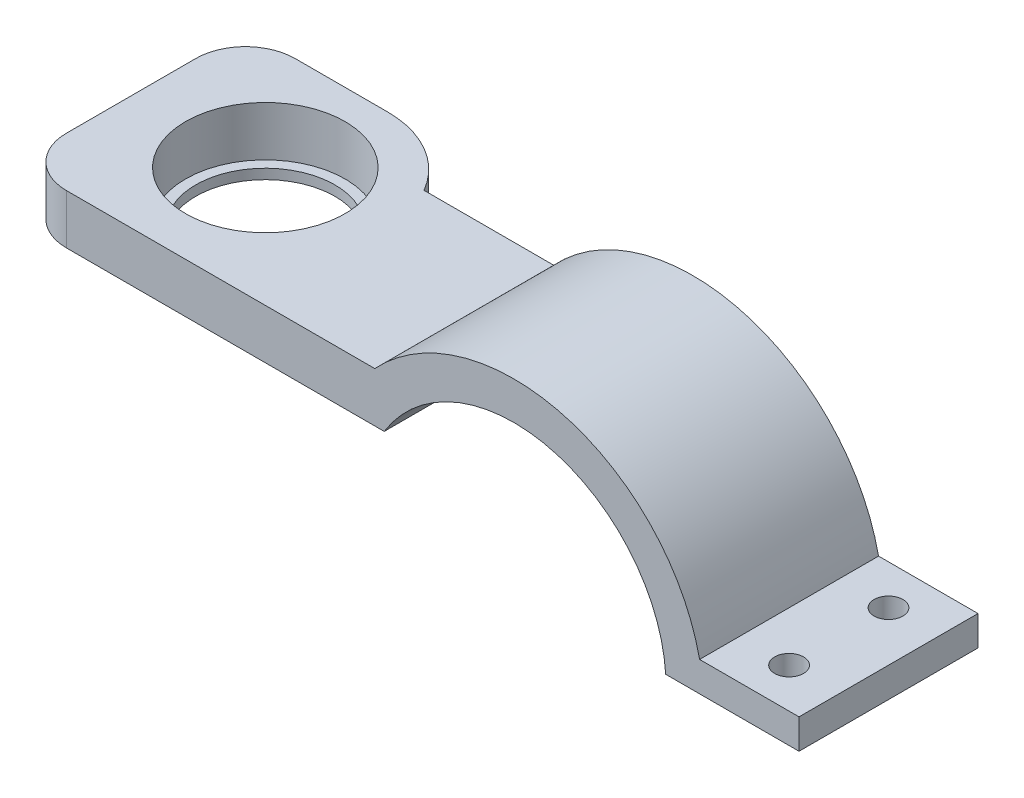
ISO-10303-21;
HEADER;
FILE_DESCRIPTION(('STEP AP214'),'2;1');
FILE_NAME('part.step','',(''),(''),'','','');
FILE_SCHEMA(('AUTOMOTIVE_DESIGN { 1 0 10303 214 1 1 1 1 }'));
ENDSEC;
DATA;
#1=APPLICATION_CONTEXT('core data for automotive mechanical design processes');
#2=APPLICATION_PROTOCOL_DEFINITION('international standard','automotive_design',2000,#1);
#3=PRODUCT_CONTEXT('',#1,'mechanical');
#4=PRODUCT('Part','Part','',(#3));
#5=PRODUCT_RELATED_PRODUCT_CATEGORY('part','',(#4));
#6=PRODUCT_DEFINITION_FORMATION('','',#4);
#7=PRODUCT_DEFINITION_CONTEXT('part definition',#1,'design');
#8=PRODUCT_DEFINITION('design','',#6,#7);
#9=PRODUCT_DEFINITION_SHAPE('','',#8);
#10=(LENGTH_UNIT() NAMED_UNIT(*) SI_UNIT(.MILLI.,.METRE.));
#11=(NAMED_UNIT(*) PLANE_ANGLE_UNIT() SI_UNIT($,.RADIAN.));
#12=(NAMED_UNIT(*) SI_UNIT($,.STERADIAN.) SOLID_ANGLE_UNIT());
#13=UNCERTAINTY_MEASURE_WITH_UNIT(LENGTH_MEASURE(1.E-05),#10,'distance_accuracy_value','');
#14=(GEOMETRIC_REPRESENTATION_CONTEXT(3) GLOBAL_UNCERTAINTY_ASSIGNED_CONTEXT((#13)) GLOBAL_UNIT_ASSIGNED_CONTEXT((#10,
#11,#12)) REPRESENTATION_CONTEXT('',''));
#15=CARTESIAN_POINT('',(0.,0.,0.));
#16=DIRECTION('',(0.,0.,1.));
#17=DIRECTION('',(1.,0.,0.));
#18=AXIS2_PLACEMENT_3D('',#15,#16,#17);
#19=CARTESIAN_POINT('',(0.,0.,0.));
#20=DIRECTION('',(0.,0.,1.));
#21=DIRECTION('',(1.,0.,0.));
#22=AXIS2_PLACEMENT_3D('',#19,#20,#21);
#23=PLANE('',#22);
#24=DIRECTION('',(0.,-1.,0.));
#25=VECTOR('',#24,1.);
#26=CARTESIAN_POINT('',(-27.0418556961807,36.496305877201,0.));
#27=LINE('',#26,#25);
#28=CARTESIAN_POINT('',(-27.0418556961807,13.,0.));
#29=VERTEX_POINT('',#28);
#30=CARTESIAN_POINT('',(-27.0418556961807,8.,0.));
#31=VERTEX_POINT('',#30);
#32=EDGE_CURVE('E145',#29,#31,#27,.T.);
#33=ORIENTED_EDGE('',*,*,#32,.F.);
#34=DIRECTION('',(-1.,0.,0.));
#35=VECTOR('',#34,1.);
#36=CARTESIAN_POINT('',(-50.,13.,0.));
#37=LINE('',#36,#35);
#38=CARTESIAN_POINT('',(-13.9932126404196,13.,0.));
#39=VERTEX_POINT('',#38);
#40=EDGE_CURVE('E150',#39,#29,#37,.T.);
#41=ORIENTED_EDGE('',*,*,#40,.F.);
#42=CARTESIAN_POINT('',(0.,0.,0.));
#43=DIRECTION('',(0.,0.,1.));
#44=DIRECTION('',(1.,0.,0.));
#45=AXIS2_PLACEMENT_3D('',#42,#43,#44);
#46=CIRCLE('',#45,19.1);
#47=CARTESIAN_POINT('',(18.6764557665527,4.,0.));
#48=VERTEX_POINT('',#47);
#49=EDGE_CURVE('E212',#48,#39,#46,.T.);
#50=ORIENTED_EDGE('',*,*,#49,.F.);
#51=DIRECTION('',(-1.,0.,0.));
#52=VECTOR('',#51,1.);
#53=CARTESIAN_POINT('',(18.6764557665527,4.,0.));
#54=LINE('',#53,#52);
#55=CARTESIAN_POINT('',(28.6764557665527,4.,0.));
#56=VERTEX_POINT('',#55);
#57=EDGE_CURVE('E209',#56,#48,#54,.T.);
#58=ORIENTED_EDGE('',*,*,#57,.F.);
#59=DIRECTION('',(0.,1.,0.));
#60=VECTOR('',#59,1.);
#61=CARTESIAN_POINT('',(28.6764557665527,4.,0.));
#62=LINE('',#61,#60);
#63=CARTESIAN_POINT('',(28.6764557665527,1.,0.));
#64=VERTEX_POINT('',#63);
#65=EDGE_CURVE('E206',#64,#56,#62,.T.);
#66=ORIENTED_EDGE('',*,*,#65,.F.);
#67=DIRECTION('',(1.,0.,0.));
#68=VECTOR('',#67,1.);
#69=CARTESIAN_POINT('',(15.2672852858653,1.,0.));
#70=LINE('',#69,#68);
#71=CARTESIAN_POINT('',(15.2672852858653,1.,0.));
#72=VERTEX_POINT('',#71);
#73=EDGE_CURVE('E203',#72,#64,#70,.T.);
#74=ORIENTED_EDGE('',*,*,#73,.F.);
#75=CARTESIAN_POINT('',(0.,0.,0.));
#76=DIRECTION('',(0.,0.,-1.));
#77=DIRECTION('',(1.,0.,0.));
#78=AXIS2_PLACEMENT_3D('',#75,#76,#77);
#79=CIRCLE('',#78,15.3);
#80=CARTESIAN_POINT('',(-13.0418556961807,8.,0.));
#81=VERTEX_POINT('',#80);
#82=EDGE_CURVE('E147',#81,#72,#79,.T.);
#83=ORIENTED_EDGE('',*,*,#82,.F.);
#84=DIRECTION('',(1.,0.,0.));
#85=VECTOR('',#84,1.);
#86=CARTESIAN_POINT('',(-13.0418556961807,8.,0.));
#87=LINE('',#86,#85);
#88=EDGE_CURVE('E136',#31,#81,#87,.T.);
#89=ORIENTED_EDGE('',*,*,#88,.F.);
#90=EDGE_LOOP('',(#33,#41,#50,#58,#66,#74,#83,#89));
#91=FACE_BOUND('',#90,.T.);
#92=ADVANCED_FACE('F45',(#91),#23,.F.);
#93=CARTESIAN_POINT('',(0.,0.,18.));
#94=DIRECTION('',(0.,0.,-1.));
#95=DIRECTION('',(-1.,0.,0.));
#96=AXIS2_PLACEMENT_3D('',#93,#94,#95);
#97=CYLINDRICAL_SURFACE('',#96,15.3);
#98=ORIENTED_EDGE('',*,*,#82,.T.);
#99=DIRECTION('',(0.,0.,-1.));
#100=VECTOR('',#99,1.);
#101=CARTESIAN_POINT('',(15.2672852858653,1.,18.));
#102=LINE('',#101,#100);
#103=CARTESIAN_POINT('',(15.2672852858653,1.,18.));
#104=VERTEX_POINT('',#103);
#105=EDGE_CURVE('E243',#104,#72,#102,.T.);
#106=ORIENTED_EDGE('',*,*,#105,.F.);
#107=CARTESIAN_POINT('',(0.,0.,18.));
#108=DIRECTION('',(0.,0.,-1.));
#109=DIRECTION('',(1.,0.,0.));
#110=AXIS2_PLACEMENT_3D('',#107,#108,#109);
#111=CIRCLE('',#110,15.3);
#112=CARTESIAN_POINT('',(-13.0418556961807,8.,18.));
#113=VERTEX_POINT('',#112);
#114=EDGE_CURVE('E149',#113,#104,#111,.T.);
#115=ORIENTED_EDGE('',*,*,#114,.F.);
#116=DIRECTION('',(0.,0.,-1.));
#117=VECTOR('',#116,1.);
#118=CARTESIAN_POINT('',(-13.0418556961807,8.,18.));
#119=LINE('',#118,#117);
#120=EDGE_CURVE('E200',#113,#81,#119,.T.);
#121=ORIENTED_EDGE('',*,*,#120,.T.);
#122=EDGE_LOOP('',(#98,#106,#115,#121));
#123=FACE_BOUND('',#122,.T.);
#124=ADVANCED_FACE('F325',(#123),#97,.F.);
#125=CARTESIAN_POINT('',(15.2672852858653,1.,18.));
#126=DIRECTION('',(0.,1.,0.));
#127=DIRECTION('',(0.,0.,1.));
#128=AXIS2_PLACEMENT_3D('',#125,#126,#127);
#129=PLANE('',#128);
#130=CARTESIAN_POINT('',(23.6764557665527,1.,4.));
#131=DIRECTION('',(0.,1.,0.));
#132=DIRECTION('',(0.,0.,1.));
#133=AXIS2_PLACEMENT_3D('',#130,#131,#132);
#134=CIRCLE('',#133,1.45);
#135=CARTESIAN_POINT('',(23.6764557665527,1.,5.45));
#136=VERTEX_POINT('',#135);
#137=EDGE_CURVE('E163',#136,#136,#134,.T.);
#138=ORIENTED_EDGE('',*,*,#137,.T.);
#139=EDGE_LOOP('',(#138));
#140=FACE_BOUND('',#139,.T.);
#141=CARTESIAN_POINT('',(23.6764557665527,1.,14.));
#142=DIRECTION('',(0.,1.,0.));
#143=DIRECTION('',(0.,0.,1.));
#144=AXIS2_PLACEMENT_3D('',#141,#142,#143);
#145=CIRCLE('',#144,1.45);
#146=CARTESIAN_POINT('',(23.6764557665527,1.,15.45));
#147=VERTEX_POINT('',#146);
#148=EDGE_CURVE('E157',#147,#147,#145,.T.);
#149=ORIENTED_EDGE('',*,*,#148,.T.);
#150=EDGE_LOOP('',(#149));
#151=FACE_BOUND('',#150,.T.);
#152=ORIENTED_EDGE('',*,*,#73,.T.);
#153=DIRECTION('',(0.,0.,-1.));
#154=VECTOR('',#153,1.);
#155=CARTESIAN_POINT('',(28.6764557665527,1.,18.));
#156=LINE('',#155,#154);
#157=CARTESIAN_POINT('',(28.6764557665527,1.,18.));
#158=VERTEX_POINT('',#157);
#159=EDGE_CURVE('E239',#158,#64,#156,.T.);
#160=ORIENTED_EDGE('',*,*,#159,.F.);
#161=DIRECTION('',(1.,0.,0.));
#162=VECTOR('',#161,1.);
#163=CARTESIAN_POINT('',(15.2672852858653,1.,18.));
#164=LINE('',#163,#162);
#165=EDGE_CURVE('E181',#104,#158,#164,.T.);
#166=ORIENTED_EDGE('',*,*,#165,.F.);
#167=ORIENTED_EDGE('',*,*,#105,.T.);
#168=EDGE_LOOP('',(#152,#160,#166,#167));
#169=FACE_BOUND('',#168,.T.);
#170=ADVANCED_FACE('F321',(#140,#151,#169),#129,.F.);
#171=CARTESIAN_POINT('',(28.6764557665527,4.,18.));
#172=DIRECTION('',(-1.,0.,0.));
#173=DIRECTION('',(0.,0.,1.));
#174=AXIS2_PLACEMENT_3D('',#171,#172,#173);
#175=PLANE('',#174);
#176=ORIENTED_EDGE('',*,*,#65,.T.);
#177=DIRECTION('',(0.,0.,-1.));
#178=VECTOR('',#177,1.);
#179=CARTESIAN_POINT('',(28.6764557665527,4.,18.));
#180=LINE('',#179,#178);
#181=CARTESIAN_POINT('',(28.6764557665527,4.,18.));
#182=VERTEX_POINT('',#181);
#183=EDGE_CURVE('E235',#182,#56,#180,.T.);
#184=ORIENTED_EDGE('',*,*,#183,.F.);
#185=DIRECTION('',(0.,1.,0.));
#186=VECTOR('',#185,1.);
#187=CARTESIAN_POINT('',(28.6764557665527,4.,18.));
#188=LINE('',#187,#186);
#189=EDGE_CURVE('E184',#158,#182,#188,.T.);
#190=ORIENTED_EDGE('',*,*,#189,.F.);
#191=ORIENTED_EDGE('',*,*,#159,.T.);
#192=EDGE_LOOP('',(#176,#184,#190,#191));
#193=FACE_BOUND('',#192,.T.);
#194=ADVANCED_FACE('F318',(#193),#175,.F.);
#195=CARTESIAN_POINT('',(18.6764557665527,4.,18.));
#196=DIRECTION('',(0.,-1.,0.));
#197=DIRECTION('',(0.,0.,-1.));
#198=AXIS2_PLACEMENT_3D('',#195,#196,#197);
#199=PLANE('',#198);
#200=CARTESIAN_POINT('',(23.6764557665527,4.,4.));
#201=DIRECTION('',(0.,1.,0.));
#202=DIRECTION('',(0.,0.,1.));
#203=AXIS2_PLACEMENT_3D('',#200,#201,#202);
#204=CIRCLE('',#203,1.45);
#205=CARTESIAN_POINT('',(23.6764557665527,4.,5.45));
#206=VERTEX_POINT('',#205);
#207=EDGE_CURVE('E167',#206,#206,#204,.T.);
#208=ORIENTED_EDGE('',*,*,#207,.F.);
#209=EDGE_LOOP('',(#208));
#210=FACE_BOUND('',#209,.T.);
#211=CARTESIAN_POINT('',(23.6764557665527,4.,14.));
#212=DIRECTION('',(0.,1.,0.));
#213=DIRECTION('',(0.,0.,1.));
#214=AXIS2_PLACEMENT_3D('',#211,#212,#213);
#215=CIRCLE('',#214,1.45);
#216=CARTESIAN_POINT('',(23.6764557665527,4.,15.45));
#217=VERTEX_POINT('',#216);
#218=EDGE_CURVE('E171',#217,#217,#215,.T.);
#219=ORIENTED_EDGE('',*,*,#218,.F.);
#220=EDGE_LOOP('',(#219));
#221=FACE_BOUND('',#220,.T.);
#222=ORIENTED_EDGE('',*,*,#57,.T.);
#223=DIRECTION('',(0.,0.,-1.));
#224=VECTOR('',#223,1.);
#225=CARTESIAN_POINT('',(18.6764557665527,4.,18.));
#226=LINE('',#225,#224);
#227=CARTESIAN_POINT('',(18.6764557665527,4.,18.));
#228=VERTEX_POINT('',#227);
#229=EDGE_CURVE('E231',#228,#48,#226,.T.);
#230=ORIENTED_EDGE('',*,*,#229,.F.);
#231=DIRECTION('',(-1.,0.,0.));
#232=VECTOR('',#231,1.);
#233=CARTESIAN_POINT('',(18.6764557665527,4.,18.));
#234=LINE('',#233,#232);
#235=EDGE_CURVE('E187',#182,#228,#234,.T.);
#236=ORIENTED_EDGE('',*,*,#235,.F.);
#237=ORIENTED_EDGE('',*,*,#183,.T.);
#238=EDGE_LOOP('',(#222,#230,#236,#237));
#239=FACE_BOUND('',#238,.T.);
#240=ADVANCED_FACE('F314',(#210,#221,#239),#199,.F.);
#241=CARTESIAN_POINT('',(0.,0.,18.));
#242=DIRECTION('',(0.,0.,-1.));
#243=DIRECTION('',(-1.,0.,0.));
#244=AXIS2_PLACEMENT_3D('',#241,#242,#243);
#245=CYLINDRICAL_SURFACE('',#244,19.1);
#246=ORIENTED_EDGE('',*,*,#49,.T.);
#247=DIRECTION('',(0.,0.,-1.));
#248=VECTOR('',#247,1.);
#249=CARTESIAN_POINT('',(-13.9932126404196,13.,18.));
#250=LINE('',#249,#248);
#251=CARTESIAN_POINT('',(-13.9932126404196,13.,18.));
#252=VERTEX_POINT('',#251);
#253=EDGE_CURVE('E227',#252,#39,#250,.T.);
#254=ORIENTED_EDGE('',*,*,#253,.F.);
#255=CARTESIAN_POINT('',(0.,0.,18.));
#256=DIRECTION('',(0.,0.,1.));
#257=DIRECTION('',(1.,0.,0.));
#258=AXIS2_PLACEMENT_3D('',#255,#256,#257);
#259=CIRCLE('',#258,19.1);
#260=EDGE_CURVE('E190',#228,#252,#259,.T.);
#261=ORIENTED_EDGE('',*,*,#260,.F.);
#262=ORIENTED_EDGE('',*,*,#229,.T.);
#263=EDGE_LOOP('',(#246,#254,#261,#262));
#264=FACE_BOUND('',#263,.T.);
#265=ADVANCED_FACE('F309',(#264),#245,.T.);
#266=CARTESIAN_POINT('',(-50.,13.,18.));
#267=DIRECTION('',(0.,-1.,0.));
#268=DIRECTION('',(0.,0.,-1.));
#269=AXIS2_PLACEMENT_3D('',#266,#267,#268);
#270=PLANE('',#269);
#271=CARTESIAN_POINT('',(-37.,13.,6.));
#272=DIRECTION('',(0.,1.,0.));
#273=DIRECTION('',(-1.,0.,0.));
#274=AXIS2_PLACEMENT_3D('',#271,#272,#273);
#275=CIRCLE('',#274,8.025);
#276=CARTESIAN_POINT('',(-45.025,13.,6.));
#277=VERTEX_POINT('',#276);
#278=EDGE_CURVE('E251',#277,#277,#275,.T.);
#279=ORIENTED_EDGE('',*,*,#278,.F.);
#280=EDGE_LOOP('',(#279));
#281=FACE_BOUND('',#280,.T.);
#282=ORIENTED_EDGE('',*,*,#40,.T.);
#283=CARTESIAN_POINT('',(-35.7021097340251,13.,5.));
#284=DIRECTION('',(0.,-1.,0.));
#285=DIRECTION('',(0.,0.,-1.));
#286=AXIS2_PLACEMENT_3D('',#283,#284,#285);
#287=CIRCLE('',#286,10.);
#288=CARTESIAN_POINT('',(-35.7021097340251,13.,-5.));
#289=VERTEX_POINT('',#288);
#290=EDGE_CURVE('E11',#29,#289,#287,.F.);
#291=ORIENTED_EDGE('',*,*,#290,.T.);
#292=DIRECTION('',(-1.,0.,0.));
#293=VECTOR('',#292,1.);
#294=CARTESIAN_POINT('',(-50.,13.,-5.));
#295=LINE('',#294,#293);
#296=CARTESIAN_POINT('',(-45.,13.,-5.));
#297=VERTEX_POINT('',#296);
#298=EDGE_CURVE('E153',#289,#297,#295,.T.);
#299=ORIENTED_EDGE('',*,*,#298,.T.);
#300=CARTESIAN_POINT('',(-45.,13.,0.));
#301=DIRECTION('',(0.,-1.,0.));
#302=DIRECTION('',(0.,0.,-1.));
#303=AXIS2_PLACEMENT_3D('',#300,#301,#302);
#304=CIRCLE('',#303,5.);
#305=CARTESIAN_POINT('',(-50.,13.,0.));
#306=VERTEX_POINT('',#305);
#307=EDGE_CURVE('E275',#297,#306,#304,.F.);
#308=ORIENTED_EDGE('',*,*,#307,.T.);
#309=DIRECTION('',(0.,0.,-1.));
#310=VECTOR('',#309,1.);
#311=CARTESIAN_POINT('',(-50.,13.,18.));
#312=LINE('',#311,#310);
#313=CARTESIAN_POINT('',(-50.,13.,13.));
#314=VERTEX_POINT('',#313);
#315=EDGE_CURVE('E223',#314,#306,#312,.T.);
#316=ORIENTED_EDGE('',*,*,#315,.F.);
#317=CARTESIAN_POINT('',(-45.,13.,13.));
#318=DIRECTION('',(0.,-1.,0.));
#319=DIRECTION('',(0.,0.,-1.));
#320=AXIS2_PLACEMENT_3D('',#317,#318,#319);
#321=CIRCLE('',#320,5.);
#322=CARTESIAN_POINT('',(-45.,13.,18.));
#323=VERTEX_POINT('',#322);
#324=EDGE_CURVE('E272',#314,#323,#321,.F.);
#325=ORIENTED_EDGE('',*,*,#324,.T.);
#326=DIRECTION('',(-1.,0.,0.));
#327=VECTOR('',#326,1.);
#328=CARTESIAN_POINT('',(-50.,13.,18.));
#329=LINE('',#328,#327);
#330=EDGE_CURVE('E193',#252,#323,#329,.T.);
#331=ORIENTED_EDGE('',*,*,#330,.F.);
#332=ORIENTED_EDGE('',*,*,#253,.T.);
#333=EDGE_LOOP('',(#282,#291,#299,#308,#316,#325,#331,#332));
#334=FACE_BOUND('',#333,.T.);
#335=ADVANCED_FACE('F287',(#281,#334),#270,.F.);
#336=CARTESIAN_POINT('',(-50.,7.99999999999999,18.));
#337=DIRECTION('',(1.,0.,0.));
#338=DIRECTION('',(0.,0.,-1.));
#339=AXIS2_PLACEMENT_3D('',#336,#337,#338);
#340=PLANE('',#339);
#341=ORIENTED_EDGE('',*,*,#315,.T.);
#342=DIRECTION('',(0.,-1.,0.));
#343=VECTOR('',#342,1.);
#344=CARTESIAN_POINT('',(-50.,7.99999999999999,0.));
#345=LINE('',#344,#343);
#346=CARTESIAN_POINT('',(-50.,7.99999999999999,0.));
#347=VERTEX_POINT('',#346);
#348=EDGE_CURVE('E258',#306,#347,#345,.T.);
#349=ORIENTED_EDGE('',*,*,#348,.T.);
#350=DIRECTION('',(0.,0.,-1.));
#351=VECTOR('',#350,1.);
#352=CARTESIAN_POINT('',(-50.,7.99999999999999,18.));
#353=LINE('',#352,#351);
#354=CARTESIAN_POINT('',(-50.,7.99999999999999,13.));
#355=VERTEX_POINT('',#354);
#356=EDGE_CURVE('E219',#355,#347,#353,.T.);
#357=ORIENTED_EDGE('',*,*,#356,.F.);
#358=DIRECTION('',(0.,-1.,0.));
#359=VECTOR('',#358,1.);
#360=CARTESIAN_POINT('',(-50.,13.,13.));
#361=LINE('',#360,#359);
#362=EDGE_CURVE('E255',#355,#314,#361,.F.);
#363=ORIENTED_EDGE('',*,*,#362,.T.);
#364=EDGE_LOOP('',(#341,#349,#357,#363));
#365=FACE_BOUND('',#364,.T.);
#366=ADVANCED_FACE('F293',(#365),#340,.F.);
#367=CARTESIAN_POINT('',(-13.0418556961807,8.,18.));
#368=DIRECTION('',(0.,1.,0.));
#369=DIRECTION('',(-1.,0.,0.));
#370=AXIS2_PLACEMENT_3D('',#367,#368,#369);
#371=PLANE('',#370);
#372=CARTESIAN_POINT('',(-37.,7.99999999999999,6.));
#373=DIRECTION('',(0.,1.,0.));
#374=DIRECTION('',(-1.,0.,0.));
#375=AXIS2_PLACEMENT_3D('',#372,#373,#374);
#376=CIRCLE('',#375,9.);
#377=CARTESIAN_POINT('',(-46.,7.99999999999999,6.));
#378=VERTEX_POINT('',#377);
#379=EDGE_CURVE('E247',#378,#378,#376,.F.);
#380=ORIENTED_EDGE('',*,*,#379,.F.);
#381=EDGE_LOOP('',(#380));
#382=FACE_BOUND('',#381,.T.);
#383=DIRECTION('',(1.,0.,0.));
#384=VECTOR('',#383,1.);
#385=CARTESIAN_POINT('',(-50.,7.99999999999999,-5.));
#386=LINE('',#385,#384);
#387=CARTESIAN_POINT('',(-45.,7.99999999999999,-5.));
#388=VERTEX_POINT('',#387);
#389=CARTESIAN_POINT('',(-35.702109734025,8.,-5.));
#390=VERTEX_POINT('',#389);
#391=EDGE_CURVE('E139',#388,#390,#386,.T.);
#392=ORIENTED_EDGE('',*,*,#391,.T.);
#393=CARTESIAN_POINT('',(-35.702109734025,8.,5.));
#394=DIRECTION('',(0.,1.,0.));
#395=DIRECTION('',(-1.,0.,0.));
#396=AXIS2_PLACEMENT_3D('',#393,#394,#395);
#397=CIRCLE('',#396,10.);
#398=EDGE_CURVE('E54',#390,#31,#397,.F.);
#399=ORIENTED_EDGE('',*,*,#398,.T.);
#400=ORIENTED_EDGE('',*,*,#88,.T.);
#401=ORIENTED_EDGE('',*,*,#120,.F.);
#402=DIRECTION('',(1.,0.,0.));
#403=VECTOR('',#402,1.);
#404=CARTESIAN_POINT('',(-13.0418556961807,8.,18.));
#405=LINE('',#404,#403);
#406=CARTESIAN_POINT('',(-45.,7.99999999999999,18.));
#407=VERTEX_POINT('',#406);
#408=EDGE_CURVE('E197',#407,#113,#405,.T.);
#409=ORIENTED_EDGE('',*,*,#408,.F.);
#410=CARTESIAN_POINT('',(-45.,7.99999999999999,13.));
#411=DIRECTION('',(0.,1.,0.));
#412=DIRECTION('',(-1.,0.,0.));
#413=AXIS2_PLACEMENT_3D('',#410,#411,#412);
#414=CIRCLE('',#413,5.);
#415=EDGE_CURVE('E262',#407,#355,#414,.F.);
#416=ORIENTED_EDGE('',*,*,#415,.T.);
#417=ORIENTED_EDGE('',*,*,#356,.T.);
#418=CARTESIAN_POINT('',(-45.,7.99999999999999,0.));
#419=DIRECTION('',(0.,1.,0.));
#420=DIRECTION('',(-1.,0.,0.));
#421=AXIS2_PLACEMENT_3D('',#418,#419,#420);
#422=CIRCLE('',#421,5.);
#423=EDGE_CURVE('E265',#347,#388,#422,.F.);
#424=ORIENTED_EDGE('',*,*,#423,.T.);
#425=EDGE_LOOP('',(#392,#399,#400,#401,#409,#416,#417,#424));
#426=FACE_BOUND('',#425,.T.);
#427=ADVANCED_FACE('F134',(#382,#426),#371,.F.);
#428=CARTESIAN_POINT('',(0.,0.,18.));
#429=DIRECTION('',(0.,0.,1.));
#430=DIRECTION('',(1.,0.,0.));
#431=AXIS2_PLACEMENT_3D('',#428,#429,#430);
#432=PLANE('',#431);
#433=ORIENTED_EDGE('',*,*,#330,.T.);
#434=DIRECTION('',(0.,-1.,0.));
#435=VECTOR('',#434,1.);
#436=CARTESIAN_POINT('',(-45.,7.99999999999999,18.));
#437=LINE('',#436,#435);
#438=EDGE_CURVE('E278',#323,#407,#437,.T.);
#439=ORIENTED_EDGE('',*,*,#438,.T.);
#440=ORIENTED_EDGE('',*,*,#408,.T.);
#441=ORIENTED_EDGE('',*,*,#114,.T.);
#442=ORIENTED_EDGE('',*,*,#165,.T.);
#443=ORIENTED_EDGE('',*,*,#189,.T.);
#444=ORIENTED_EDGE('',*,*,#235,.T.);
#445=ORIENTED_EDGE('',*,*,#260,.T.);
#446=EDGE_LOOP('',(#433,#439,#440,#441,#442,#443,#444,#445));
#447=FACE_BOUND('',#446,.T.);
#448=ADVANCED_FACE('F303',(#447),#432,.T.);
#449=CARTESIAN_POINT('',(23.6764557665527,1.,14.));
#450=DIRECTION('',(0.,1.,0.));
#451=DIRECTION('',(0.,0.,1.));
#452=AXIS2_PLACEMENT_3D('',#449,#450,#451);
#453=CYLINDRICAL_SURFACE('',#452,1.45);
#454=ORIENTED_EDGE('',*,*,#148,.F.);
#455=EDGE_LOOP('',(#454));
#456=FACE_BOUND('',#455,.T.);
#457=ORIENTED_EDGE('',*,*,#218,.T.);
#458=EDGE_LOOP('',(#457));
#459=FACE_BOUND('',#458,.T.);
#460=ADVANCED_FACE('F444',(#456,#459),#453,.F.);
#461=CARTESIAN_POINT('',(23.6764557665527,1.,4.));
#462=DIRECTION('',(0.,1.,0.));
#463=DIRECTION('',(0.,0.,1.));
#464=AXIS2_PLACEMENT_3D('',#461,#462,#463);
#465=CYLINDRICAL_SURFACE('',#464,1.45);
#466=ORIENTED_EDGE('',*,*,#137,.F.);
#467=EDGE_LOOP('',(#466));
#468=FACE_BOUND('',#467,.T.);
#469=ORIENTED_EDGE('',*,*,#207,.T.);
#470=EDGE_LOOP('',(#469));
#471=FACE_BOUND('',#470,.T.);
#472=ADVANCED_FACE('F354',(#468,#471),#465,.F.);
#473=CARTESIAN_POINT('',(-50.,36.496305877201,-5.));
#474=DIRECTION('',(0.,0.,-1.));
#475=DIRECTION('',(-1.,0.,0.));
#476=AXIS2_PLACEMENT_3D('',#473,#474,#475);
#477=PLANE('',#476);
#478=ORIENTED_EDGE('',*,*,#298,.F.);
#479=DIRECTION('',(0.,1.,0.));
#480=VECTOR('',#479,1.);
#481=CARTESIAN_POINT('',(-35.702109734025,8.,-5.));
#482=LINE('',#481,#480);
#483=EDGE_CURVE('E141',#289,#390,#482,.F.);
#484=ORIENTED_EDGE('',*,*,#483,.T.);
#485=ORIENTED_EDGE('',*,*,#391,.F.);
#486=DIRECTION('',(0.,-1.,0.));
#487=VECTOR('',#486,1.);
#488=CARTESIAN_POINT('',(-45.,13.,-5.));
#489=LINE('',#488,#487);
#490=EDGE_CURVE('E268',#388,#297,#489,.F.);
#491=ORIENTED_EDGE('',*,*,#490,.T.);
#492=EDGE_LOOP('',(#478,#484,#485,#491));
#493=FACE_BOUND('',#492,.T.);
#494=ADVANCED_FACE('F284',(#493),#477,.T.);
#495=CARTESIAN_POINT('',(-37.,0.999999999999994,6.));
#496=DIRECTION('',(0.,1.,0.));
#497=DIRECTION('',(-1.,0.,0.));
#498=AXIS2_PLACEMENT_3D('',#495,#496,#497);
#499=CYLINDRICAL_SURFACE('',#498,8.025);
#500=ORIENTED_EDGE('',*,*,#278,.T.);
#501=EDGE_LOOP('',(#500));
#502=FACE_BOUND('',#501,.T.);
#503=CARTESIAN_POINT('',(-37.,7.99999999999999,6.));
#504=DIRECTION('',(0.,1.,0.));
#505=DIRECTION('',(-1.,0.,0.));
#506=AXIS2_PLACEMENT_3D('',#503,#504,#505);
#507=CIRCLE('',#506,8.025);
#508=CARTESIAN_POINT('',(-45.025,7.99999999999999,6.));
#509=VERTEX_POINT('',#508);
#510=EDGE_CURVE('E159',#509,#509,#507,.T.);
#511=ORIENTED_EDGE('',*,*,#510,.F.);
#512=EDGE_LOOP('',(#511));
#513=FACE_BOUND('',#512,.T.);
#514=ADVANCED_FACE('F353',(#502,#513),#499,.F.);
#515=CARTESIAN_POINT('',(-37.,7.99999999999999,6.));
#516=DIRECTION('',(0.,-1.,0.));
#517=DIRECTION('',(1.,0.,0.));
#518=AXIS2_PLACEMENT_3D('',#515,#516,#517);
#519=PLANE('',#518);
#520=CARTESIAN_POINT('',(-37.,7.99999999999999,6.));
#521=DIRECTION('',(0.,-1.,0.));
#522=DIRECTION('',(1.,0.,0.));
#523=AXIS2_PLACEMENT_3D('',#520,#521,#522);
#524=CIRCLE('',#523,7.);
#525=CARTESIAN_POINT('',(-30.,8.,6.));
#526=VERTEX_POINT('',#525);
#527=EDGE_CURVE('E533',#526,#526,#524,.T.);
#528=ORIENTED_EDGE('',*,*,#527,.T.);
#529=EDGE_LOOP('',(#528));
#530=FACE_BOUND('',#529,.T.);
#531=ORIENTED_EDGE('',*,*,#510,.T.);
#532=EDGE_LOOP('',(#531));
#533=FACE_BOUND('',#532,.T.);
#534=ADVANCED_FACE('F391',(#530,#533),#519,.F.);
#535=CARTESIAN_POINT('',(-37.,6.99999999999999,6.));
#536=DIRECTION('',(0.,-1.,0.));
#537=DIRECTION('',(1.,0.,0.));
#538=AXIS2_PLACEMENT_3D('',#535,#536,#537);
#539=PLANE('',#538);
#540=CARTESIAN_POINT('',(-37.,6.99999999999999,6.));
#541=DIRECTION('',(0.,-1.,0.));
#542=DIRECTION('',(1.,0.,0.));
#543=AXIS2_PLACEMENT_3D('',#540,#541,#542);
#544=CIRCLE('',#543,9.);
#545=CARTESIAN_POINT('',(-28.,7.,6.));
#546=VERTEX_POINT('',#545);
#547=EDGE_CURVE('E537',#546,#546,#544,.T.);
#548=ORIENTED_EDGE('',*,*,#547,.T.);
#549=EDGE_LOOP('',(#548));
#550=FACE_BOUND('',#549,.T.);
#551=CARTESIAN_POINT('',(-37.,6.99999999999999,6.));
#552=DIRECTION('',(0.,-1.,0.));
#553=DIRECTION('',(1.,0.,0.));
#554=AXIS2_PLACEMENT_3D('',#551,#552,#553);
#555=CIRCLE('',#554,7.);
#556=CARTESIAN_POINT('',(-30.,7.,6.));
#557=VERTEX_POINT('',#556);
#558=EDGE_CURVE('E530',#557,#557,#555,.T.);
#559=ORIENTED_EDGE('',*,*,#558,.F.);
#560=EDGE_LOOP('',(#559));
#561=FACE_BOUND('',#560,.T.);
#562=ADVANCED_FACE('F400',(#550,#561),#539,.T.);
#563=CARTESIAN_POINT('',(-37.,6.99999999999999,6.));
#564=DIRECTION('',(0.,1.,0.));
#565=DIRECTION('',(-1.,0.,0.));
#566=AXIS2_PLACEMENT_3D('',#563,#564,#565);
#567=CYLINDRICAL_SURFACE('',#566,9.);
#568=ORIENTED_EDGE('',*,*,#547,.F.);
#569=EDGE_LOOP('',(#568));
#570=FACE_BOUND('',#569,.T.);
#571=ORIENTED_EDGE('',*,*,#379,.T.);
#572=EDGE_LOOP('',(#571));
#573=FACE_BOUND('',#572,.T.);
#574=ADVANCED_FACE('F409',(#570,#573),#567,.T.);
#575=CARTESIAN_POINT('',(-37.,6.99999999999999,6.));
#576=DIRECTION('',(0.,1.,0.));
#577=DIRECTION('',(-1.,0.,0.));
#578=AXIS2_PLACEMENT_3D('',#575,#576,#577);
#579=CYLINDRICAL_SURFACE('',#578,7.);
#580=ORIENTED_EDGE('',*,*,#558,.T.);
#581=EDGE_LOOP('',(#580));
#582=FACE_BOUND('',#581,.T.);
#583=ORIENTED_EDGE('',*,*,#527,.F.);
#584=EDGE_LOOP('',(#583));
#585=FACE_BOUND('',#584,.T.);
#586=ADVANCED_FACE('F339',(#582,#585),#579,.F.);
#587=CARTESIAN_POINT('',(-45.,7.99999999999999,0.));
#588=DIRECTION('',(0.,1.,0.));
#589=DIRECTION('',(0.,0.,1.));
#590=AXIS2_PLACEMENT_3D('',#587,#588,#589);
#591=CYLINDRICAL_SURFACE('',#590,5.);
#592=ORIENTED_EDGE('',*,*,#307,.F.);
#593=ORIENTED_EDGE('',*,*,#490,.F.);
#594=ORIENTED_EDGE('',*,*,#423,.F.);
#595=ORIENTED_EDGE('',*,*,#348,.F.);
#596=EDGE_LOOP('',(#592,#593,#594,#595));
#597=FACE_BOUND('',#596,.T.);
#598=ADVANCED_FACE('F296',(#597),#591,.T.);
#599=CARTESIAN_POINT('',(-45.,0.,13.));
#600=DIRECTION('',(0.,1.,0.));
#601=DIRECTION('',(0.,0.,1.));
#602=AXIS2_PLACEMENT_3D('',#599,#600,#601);
#603=CYLINDRICAL_SURFACE('',#602,5.);
#604=ORIENTED_EDGE('',*,*,#324,.F.);
#605=ORIENTED_EDGE('',*,*,#362,.F.);
#606=ORIENTED_EDGE('',*,*,#415,.F.);
#607=ORIENTED_EDGE('',*,*,#438,.F.);
#608=EDGE_LOOP('',(#604,#605,#606,#607));
#609=FACE_BOUND('',#608,.T.);
#610=ADVANCED_FACE('F299',(#609),#603,.T.);
#611=CARTESIAN_POINT('',(-35.7021097340251,36.496305877201,5.));
#612=DIRECTION('',(0.,-1.,0.));
#613=DIRECTION('',(1.,0.,0.));
#614=AXIS2_PLACEMENT_3D('',#611,#612,#613);
#615=CYLINDRICAL_SURFACE('',#614,10.);
#616=ORIENTED_EDGE('',*,*,#290,.F.);
#617=ORIENTED_EDGE('',*,*,#32,.T.);
#618=ORIENTED_EDGE('',*,*,#398,.F.);
#619=ORIENTED_EDGE('',*,*,#483,.F.);
#620=EDGE_LOOP('',(#616,#617,#618,#619));
#621=FACE_BOUND('',#620,.T.);
#622=ADVANCED_FACE('F47',(#621),#615,.T.);
#623=CLOSED_SHELL('',(#92,#124,#170,#194,#240,#265,#335,#366,#427,#448,#460,#472,#494,#514,#534,
#562,#574,#586,#598,#610,#622));
#624=MANIFOLD_SOLID_BREP('B2',#623);
#625=ADVANCED_BREP_SHAPE_REPRESENTATION('',(#18,#624),#14);
#626=SHAPE_DEFINITION_REPRESENTATION(#9,#625);
ENDSEC;
END-ISO-10303-21;
